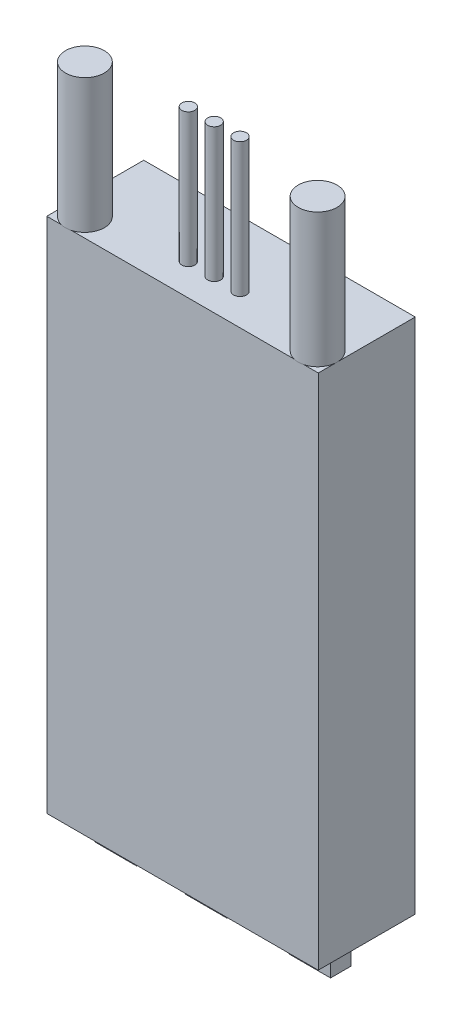
ISO-10303-21;
HEADER;
FILE_DESCRIPTION(('STEP AP214'),'2;1');
FILE_NAME('part.step','',(''),(''),'','','');
FILE_SCHEMA(('AUTOMOTIVE_DESIGN { 1 0 10303 214 1 1 1 1 }'));
ENDSEC;
DATA;
#1=APPLICATION_CONTEXT('core data for automotive mechanical design processes');
#2=APPLICATION_PROTOCOL_DEFINITION('international standard','automotive_design',2000,#1);
#3=PRODUCT_CONTEXT('',#1,'mechanical');
#4=PRODUCT('Part','Part','',(#3));
#5=PRODUCT_RELATED_PRODUCT_CATEGORY('part','',(#4));
#6=PRODUCT_DEFINITION_FORMATION('','',#4);
#7=PRODUCT_DEFINITION_CONTEXT('part definition',#1,'design');
#8=PRODUCT_DEFINITION('design','',#6,#7);
#9=PRODUCT_DEFINITION_SHAPE('','',#8);
#10=(LENGTH_UNIT() NAMED_UNIT(*) SI_UNIT(.MILLI.,.METRE.));
#11=(NAMED_UNIT(*) PLANE_ANGLE_UNIT() SI_UNIT($,.RADIAN.));
#12=(NAMED_UNIT(*) SI_UNIT($,.STERADIAN.) SOLID_ANGLE_UNIT());
#13=UNCERTAINTY_MEASURE_WITH_UNIT(LENGTH_MEASURE(1.E-05),#10,'distance_accuracy_value','');
#14=(GEOMETRIC_REPRESENTATION_CONTEXT(3) GLOBAL_UNCERTAINTY_ASSIGNED_CONTEXT((#13)) GLOBAL_UNIT_ASSIGNED_CONTEXT((#10,
#11,#12)) REPRESENTATION_CONTEXT('',''));
#15=CARTESIAN_POINT('',(0.,0.,0.));
#16=DIRECTION('',(0.,0.,1.));
#17=DIRECTION('',(1.,0.,0.));
#18=AXIS2_PLACEMENT_3D('',#15,#16,#17);
#19=CARTESIAN_POINT('',(-10.5,20.,3.75));
#20=DIRECTION('',(0.,-1.,0.));
#21=DIRECTION('',(1.,0.,0.));
#22=AXIS2_PLACEMENT_3D('',#19,#20,#21);
#23=PLANE('',#22);
#24=CARTESIAN_POINT('',(9.,20.,2.3));
#25=DIRECTION('',(0.,1.,0.));
#26=DIRECTION('',(-1.,0.,0.));
#27=AXIS2_PLACEMENT_3D('',#24,#25,#26);
#28=CIRCLE('',#27,1.5);
#29=CARTESIAN_POINT('',(9.38405728739343,20.,3.75));
#30=VERTEX_POINT('',#29);
#31=CARTESIAN_POINT('',(10.5,20.,2.3));
#32=VERTEX_POINT('',#31);
#33=EDGE_CURVE('E11',#30,#32,#28,.T.);
#34=ORIENTED_EDGE('',*,*,#33,.F.);
#35=DIRECTION('',(-1.,0.,0.));
#36=VECTOR('',#35,1.);
#37=CARTESIAN_POINT('',(-10.5,20.,3.75));
#38=LINE('',#37,#36);
#39=CARTESIAN_POINT('',(10.5,20.,3.75));
#40=VERTEX_POINT('',#39);
#41=EDGE_CURVE('E302',#40,#30,#38,.T.);
#42=ORIENTED_EDGE('',*,*,#41,.F.);
#43=DIRECTION('',(0.,0.,-1.));
#44=VECTOR('',#43,1.);
#45=CARTESIAN_POINT('',(10.5,20.,3.75));
#46=LINE('',#45,#44);
#47=EDGE_CURVE('E323',#40,#32,#46,.T.);
#48=ORIENTED_EDGE('',*,*,#47,.T.);
#49=EDGE_LOOP('',(#34,#42,#48));
#50=FACE_BOUND('',#49,.T.);
#51=ADVANCED_FACE('F39',(#50),#23,.F.);
#52=CARTESIAN_POINT('',(-9.,20.,2.3));
#53=DIRECTION('',(0.,1.,0.));
#54=DIRECTION('',(-1.,0.,0.));
#55=AXIS2_PLACEMENT_3D('',#52,#53,#54);
#56=CIRCLE('',#55,1.5);
#57=CARTESIAN_POINT('',(-10.5,20.,2.3));
#58=VERTEX_POINT('',#57);
#59=CARTESIAN_POINT('',(-9.38405728739343,20.,3.75));
#60=VERTEX_POINT('',#59);
#61=EDGE_CURVE('E187',#58,#60,#56,.T.);
#62=ORIENTED_EDGE('',*,*,#61,.F.);
#63=DIRECTION('',(0.,0.,-1.));
#64=VECTOR('',#63,1.);
#65=CARTESIAN_POINT('',(-10.5,20.,3.75));
#66=LINE('',#65,#64);
#67=CARTESIAN_POINT('',(-10.5,20.,3.75));
#68=VERTEX_POINT('',#67);
#69=EDGE_CURVE('E43',#68,#58,#66,.T.);
#70=ORIENTED_EDGE('',*,*,#69,.F.);
#71=EDGE_CURVE('E65',#60,#68,#38,.T.);
#72=ORIENTED_EDGE('',*,*,#71,.F.);
#73=EDGE_LOOP('',(#62,#70,#72));
#74=FACE_BOUND('',#73,.T.);
#75=ADVANCED_FACE('F190',(#74),#23,.F.);
#76=CARTESIAN_POINT('',(8.61594271260657,20.,3.75));
#77=VERTEX_POINT('',#76);
#78=EDGE_CURVE('E48',#32,#77,#28,.T.);
#79=ORIENTED_EDGE('',*,*,#78,.F.);
#80=CARTESIAN_POINT('',(10.5,20.,-3.75));
#81=VERTEX_POINT('',#80);
#82=EDGE_CURVE('E314',#32,#81,#46,.T.);
#83=ORIENTED_EDGE('',*,*,#82,.T.);
#84=DIRECTION('',(-1.,0.,0.));
#85=VECTOR('',#84,1.);
#86=CARTESIAN_POINT('',(-10.5,20.,-3.75));
#87=LINE('',#86,#85);
#88=CARTESIAN_POINT('',(-10.5,20.,-3.75));
#89=VERTEX_POINT('',#88);
#90=EDGE_CURVE('E183',#81,#89,#87,.T.);
#91=ORIENTED_EDGE('',*,*,#90,.T.);
#92=EDGE_CURVE('E171',#58,#89,#66,.T.);
#93=ORIENTED_EDGE('',*,*,#92,.F.);
#94=CARTESIAN_POINT('',(-8.61594271260657,20.,3.75));
#95=VERTEX_POINT('',#94);
#96=EDGE_CURVE('E179',#95,#58,#56,.T.);
#97=ORIENTED_EDGE('',*,*,#96,.F.);
#98=EDGE_CURVE('E350',#77,#95,#38,.T.);
#99=ORIENTED_EDGE('',*,*,#98,.F.);
#100=EDGE_LOOP('',(#79,#83,#91,#93,#97,#99));
#101=FACE_BOUND('',#100,.T.);
#102=CARTESIAN_POINT('',(-2.00000000000001,20.,1.3));
#103=DIRECTION('',(0.,1.,0.));
#104=DIRECTION('',(-1.,0.,0.));
#105=AXIS2_PLACEMENT_3D('',#102,#103,#104);
#106=CIRCLE('',#105,0.5);
#107=CARTESIAN_POINT('',(-2.50000000000001,20.,1.3));
#108=VERTEX_POINT('',#107);
#109=EDGE_CURVE('E352',#108,#108,#106,.T.);
#110=ORIENTED_EDGE('',*,*,#109,.F.);
#111=EDGE_LOOP('',(#110));
#112=FACE_BOUND('',#111,.T.);
#113=CARTESIAN_POINT('',(1.99999999999999,20.,1.3));
#114=DIRECTION('',(0.,1.,0.));
#115=DIRECTION('',(-1.,0.,0.));
#116=AXIS2_PLACEMENT_3D('',#113,#114,#115);
#117=CIRCLE('',#116,0.5);
#118=CARTESIAN_POINT('',(1.49999999999999,20.,1.3));
#119=VERTEX_POINT('',#118);
#120=EDGE_CURVE('E196',#119,#119,#117,.T.);
#121=ORIENTED_EDGE('',*,*,#120,.F.);
#122=EDGE_LOOP('',(#121));
#123=FACE_BOUND('',#122,.T.);
#124=CARTESIAN_POINT('',(0.,20.,1.3));
#125=DIRECTION('',(0.,1.,0.));
#126=DIRECTION('',(-1.,0.,0.));
#127=AXIS2_PLACEMENT_3D('',#124,#125,#126);
#128=CIRCLE('',#127,0.5);
#129=CARTESIAN_POINT('',(-0.500000000000007,20.,1.3));
#130=VERTEX_POINT('',#129);
#131=EDGE_CURVE('E198',#130,#130,#128,.T.);
#132=ORIENTED_EDGE('',*,*,#131,.F.);
#133=EDGE_LOOP('',(#132));
#134=FACE_BOUND('',#133,.T.);
#135=ADVANCED_FACE('F41',(#101,#112,#123,#134),#23,.F.);
#136=CARTESIAN_POINT('',(-10.5,-20.,3.75));
#137=DIRECTION('',(1.,0.,0.));
#138=DIRECTION('',(0.,0.,-1.));
#139=AXIS2_PLACEMENT_3D('',#136,#137,#138);
#140=PLANE('',#139);
#141=DIRECTION('',(0.,-1.,0.));
#142=VECTOR('',#141,1.);
#143=CARTESIAN_POINT('',(-10.5,-20.,-3.75));
#144=LINE('',#143,#142);
#145=CARTESIAN_POINT('',(-10.5,-20.,-3.75));
#146=VERTEX_POINT('',#145);
#147=EDGE_CURVE('E316',#89,#146,#144,.T.);
#148=ORIENTED_EDGE('',*,*,#147,.T.);
#149=DIRECTION('',(0.,0.,-1.));
#150=VECTOR('',#149,1.);
#151=CARTESIAN_POINT('',(-10.5,-20.,3.75));
#152=LINE('',#151,#150);
#153=CARTESIAN_POINT('',(-10.5,-20.,3.75));
#154=VERTEX_POINT('',#153);
#155=EDGE_CURVE('E188',#154,#146,#152,.T.);
#156=ORIENTED_EDGE('',*,*,#155,.F.);
#157=DIRECTION('',(0.,-1.,0.));
#158=VECTOR('',#157,1.);
#159=CARTESIAN_POINT('',(-10.5,-20.,3.75));
#160=LINE('',#159,#158);
#161=EDGE_CURVE('E176',#68,#154,#160,.T.);
#162=ORIENTED_EDGE('',*,*,#161,.F.);
#163=ORIENTED_EDGE('',*,*,#69,.T.);
#164=ORIENTED_EDGE('',*,*,#92,.T.);
#165=EDGE_LOOP('',(#148,#156,#162,#163,#164));
#166=FACE_BOUND('',#165,.T.);
#167=ADVANCED_FACE('F175',(#166),#140,.F.);
#168=CARTESIAN_POINT('',(-10.5,-20.,3.75));
#169=DIRECTION('',(0.,1.,0.));
#170=DIRECTION('',(-1.,0.,0.));
#171=AXIS2_PLACEMENT_3D('',#168,#169,#170);
#172=PLANE('',#171);
#173=DIRECTION('',(0.,0.,-1.));
#174=VECTOR('',#173,1.);
#175=CARTESIAN_POINT('',(-6.5,-20.,0.8));
#176=LINE('',#175,#174);
#177=CARTESIAN_POINT('',(-6.5,-20.,0.8));
#178=VERTEX_POINT('',#177);
#179=CARTESIAN_POINT('',(-6.5,-20.,-0.8));
#180=VERTEX_POINT('',#179);
#181=EDGE_CURVE('E222',#178,#180,#176,.T.);
#182=ORIENTED_EDGE('',*,*,#181,.T.);
#183=DIRECTION('',(-1.,0.,0.));
#184=VECTOR('',#183,1.);
#185=CARTESIAN_POINT('',(-9.7,-20.,-0.8));
#186=LINE('',#185,#184);
#187=CARTESIAN_POINT('',(-9.7,-20.,-0.8));
#188=VERTEX_POINT('',#187);
#189=EDGE_CURVE('E225',#180,#188,#186,.T.);
#190=ORIENTED_EDGE('',*,*,#189,.T.);
#191=DIRECTION('',(0.,0.,-1.));
#192=VECTOR('',#191,1.);
#193=CARTESIAN_POINT('',(-9.7,-20.,0.8));
#194=LINE('',#193,#192);
#195=CARTESIAN_POINT('',(-9.7,-20.,0.8));
#196=VERTEX_POINT('',#195);
#197=EDGE_CURVE('E238',#196,#188,#194,.T.);
#198=ORIENTED_EDGE('',*,*,#197,.F.);
#199=DIRECTION('',(-1.,0.,0.));
#200=VECTOR('',#199,1.);
#201=CARTESIAN_POINT('',(-9.7,-20.,0.8));
#202=LINE('',#201,#200);
#203=EDGE_CURVE('E211',#178,#196,#202,.T.);
#204=ORIENTED_EDGE('',*,*,#203,.F.);
#205=EDGE_LOOP('',(#182,#190,#198,#204));
#206=FACE_BOUND('',#205,.T.);
#207=DIRECTION('',(0.,0.,-1.));
#208=VECTOR('',#207,1.);
#209=CARTESIAN_POINT('',(0.500000000000002,-20.,0.8));
#210=LINE('',#209,#208);
#211=CARTESIAN_POINT('',(0.500000000000002,-20.,0.8));
#212=VERTEX_POINT('',#211);
#213=CARTESIAN_POINT('',(0.500000000000002,-20.,-0.8));
#214=VERTEX_POINT('',#213);
#215=EDGE_CURVE('E251',#212,#214,#210,.T.);
#216=ORIENTED_EDGE('',*,*,#215,.T.);
#217=DIRECTION('',(-1.,0.,0.));
#218=VECTOR('',#217,1.);
#219=CARTESIAN_POINT('',(-2.7,-20.,-0.8));
#220=LINE('',#219,#218);
#221=CARTESIAN_POINT('',(-2.7,-20.,-0.8));
#222=VERTEX_POINT('',#221);
#223=EDGE_CURVE('E228',#214,#222,#220,.T.);
#224=ORIENTED_EDGE('',*,*,#223,.T.);
#225=DIRECTION('',(0.,0.,-1.));
#226=VECTOR('',#225,1.);
#227=CARTESIAN_POINT('',(-2.7,-20.,0.8));
#228=LINE('',#227,#226);
#229=CARTESIAN_POINT('',(-2.7,-20.,0.8));
#230=VERTEX_POINT('',#229);
#231=EDGE_CURVE('E242',#230,#222,#228,.T.);
#232=ORIENTED_EDGE('',*,*,#231,.F.);
#233=DIRECTION('',(-1.,0.,0.));
#234=VECTOR('',#233,1.);
#235=CARTESIAN_POINT('',(-2.7,-20.,0.8));
#236=LINE('',#235,#234);
#237=EDGE_CURVE('E261',#212,#230,#236,.T.);
#238=ORIENTED_EDGE('',*,*,#237,.F.);
#239=EDGE_LOOP('',(#216,#224,#232,#238));
#240=FACE_BOUND('',#239,.T.);
#241=DIRECTION('',(0.,0.,-1.));
#242=VECTOR('',#241,1.);
#243=CARTESIAN_POINT('',(8.5,-20.,0.8));
#244=LINE('',#243,#242);
#245=CARTESIAN_POINT('',(8.5,-20.,0.8));
#246=VERTEX_POINT('',#245);
#247=CARTESIAN_POINT('',(8.5,-20.,-0.8));
#248=VERTEX_POINT('',#247);
#249=EDGE_CURVE('E285',#246,#248,#244,.T.);
#250=ORIENTED_EDGE('',*,*,#249,.T.);
#251=DIRECTION('',(-1.,0.,0.));
#252=VECTOR('',#251,1.);
#253=CARTESIAN_POINT('',(5.3,-20.,-0.8));
#254=LINE('',#253,#252);
#255=CARTESIAN_POINT('',(5.3,-20.,-0.8));
#256=VERTEX_POINT('',#255);
#257=EDGE_CURVE('E250',#248,#256,#254,.T.);
#258=ORIENTED_EDGE('',*,*,#257,.T.);
#259=DIRECTION('',(0.,0.,-1.));
#260=VECTOR('',#259,1.);
#261=CARTESIAN_POINT('',(5.3,-20.,0.8));
#262=LINE('',#261,#260);
#263=CARTESIAN_POINT('',(5.3,-20.,0.8));
#264=VERTEX_POINT('',#263);
#265=EDGE_CURVE('E273',#264,#256,#262,.T.);
#266=ORIENTED_EDGE('',*,*,#265,.F.);
#267=DIRECTION('',(-1.,0.,0.));
#268=VECTOR('',#267,1.);
#269=CARTESIAN_POINT('',(5.3,-20.,0.8));
#270=LINE('',#269,#268);
#271=EDGE_CURVE('E295',#246,#264,#270,.T.);
#272=ORIENTED_EDGE('',*,*,#271,.F.);
#273=EDGE_LOOP('',(#250,#258,#266,#272));
#274=FACE_BOUND('',#273,.T.);
#275=DIRECTION('',(1.,0.,0.));
#276=VECTOR('',#275,1.);
#277=CARTESIAN_POINT('',(-10.5,-20.,-3.75));
#278=LINE('',#277,#276);
#279=CARTESIAN_POINT('',(10.5,-20.,-3.75));
#280=VERTEX_POINT('',#279);
#281=EDGE_CURVE('E318',#146,#280,#278,.T.);
#282=ORIENTED_EDGE('',*,*,#281,.T.);
#283=DIRECTION('',(0.,0.,-1.));
#284=VECTOR('',#283,1.);
#285=CARTESIAN_POINT('',(10.5,-20.,3.75));
#286=LINE('',#285,#284);
#287=CARTESIAN_POINT('',(10.5,-20.,3.75));
#288=VERTEX_POINT('',#287);
#289=EDGE_CURVE('E326',#288,#280,#286,.T.);
#290=ORIENTED_EDGE('',*,*,#289,.F.);
#291=DIRECTION('',(1.,0.,0.));
#292=VECTOR('',#291,1.);
#293=CARTESIAN_POINT('',(-10.5,-20.,3.75));
#294=LINE('',#293,#292);
#295=EDGE_CURVE('E309',#154,#288,#294,.T.);
#296=ORIENTED_EDGE('',*,*,#295,.F.);
#297=ORIENTED_EDGE('',*,*,#155,.T.);
#298=EDGE_LOOP('',(#282,#290,#296,#297));
#299=FACE_BOUND('',#298,.T.);
#300=ADVANCED_FACE('F335',(#206,#240,#274,#299),#172,.F.);
#301=CARTESIAN_POINT('',(10.5,-20.,3.75));
#302=DIRECTION('',(-1.,0.,0.));
#303=DIRECTION('',(0.,0.,1.));
#304=AXIS2_PLACEMENT_3D('',#301,#302,#303);
#305=PLANE('',#304);
#306=DIRECTION('',(0.,1.,0.));
#307=VECTOR('',#306,1.);
#308=CARTESIAN_POINT('',(10.5,-20.,-3.75));
#309=LINE('',#308,#307);
#310=EDGE_CURVE('E319',#280,#81,#309,.T.);
#311=ORIENTED_EDGE('',*,*,#310,.T.);
#312=ORIENTED_EDGE('',*,*,#82,.F.);
#313=ORIENTED_EDGE('',*,*,#47,.F.);
#314=DIRECTION('',(0.,1.,0.));
#315=VECTOR('',#314,1.);
#316=CARTESIAN_POINT('',(10.5,-20.,3.75));
#317=LINE('',#316,#315);
#318=EDGE_CURVE('E315',#288,#40,#317,.T.);
#319=ORIENTED_EDGE('',*,*,#318,.F.);
#320=ORIENTED_EDGE('',*,*,#289,.T.);
#321=EDGE_LOOP('',(#311,#312,#313,#319,#320));
#322=FACE_BOUND('',#321,.T.);
#323=ADVANCED_FACE('F337',(#322),#305,.F.);
#324=CARTESIAN_POINT('',(0.,0.,3.75));
#325=DIRECTION('',(0.,0.,1.));
#326=DIRECTION('',(1.,0.,0.));
#327=AXIS2_PLACEMENT_3D('',#324,#325,#326);
#328=PLANE('',#327);
#329=ORIENTED_EDGE('',*,*,#41,.T.);
#330=EDGE_CURVE('E306',#30,#77,#38,.T.);
#331=ORIENTED_EDGE('',*,*,#330,.T.);
#332=ORIENTED_EDGE('',*,*,#98,.T.);
#333=EDGE_CURVE('E347',#95,#60,#38,.T.);
#334=ORIENTED_EDGE('',*,*,#333,.T.);
#335=ORIENTED_EDGE('',*,*,#71,.T.);
#336=ORIENTED_EDGE('',*,*,#161,.T.);
#337=ORIENTED_EDGE('',*,*,#295,.T.);
#338=ORIENTED_EDGE('',*,*,#318,.T.);
#339=EDGE_LOOP('',(#329,#331,#332,#334,#335,#336,#337,#338));
#340=FACE_BOUND('',#339,.T.);
#341=ADVANCED_FACE('F341',(#340),#328,.T.);
#342=CARTESIAN_POINT('',(0.,0.,-3.75));
#343=DIRECTION('',(0.,0.,1.));
#344=DIRECTION('',(1.,0.,0.));
#345=AXIS2_PLACEMENT_3D('',#342,#343,#344);
#346=PLANE('',#345);
#347=ORIENTED_EDGE('',*,*,#90,.F.);
#348=ORIENTED_EDGE('',*,*,#310,.F.);
#349=ORIENTED_EDGE('',*,*,#281,.F.);
#350=ORIENTED_EDGE('',*,*,#147,.F.);
#351=EDGE_LOOP('',(#347,#348,#349,#350));
#352=FACE_BOUND('',#351,.T.);
#353=ADVANCED_FACE('F338',(#352),#346,.F.);
#354=CARTESIAN_POINT('',(5.3,-20.,0.8));
#355=DIRECTION('',(1.,0.,0.));
#356=DIRECTION('',(0.,1.,0.));
#357=AXIS2_PLACEMENT_3D('',#354,#355,#356);
#358=PLANE('',#357);
#359=DIRECTION('',(0.,-1.,0.));
#360=VECTOR('',#359,1.);
#361=CARTESIAN_POINT('',(5.3,-20.,-0.8));
#362=LINE('',#361,#360);
#363=CARTESIAN_POINT('',(5.3,-23.,-0.8));
#364=VERTEX_POINT('',#363);
#365=EDGE_CURVE('E294',#256,#364,#362,.T.);
#366=ORIENTED_EDGE('',*,*,#365,.T.);
#367=DIRECTION('',(0.,0.,-1.));
#368=VECTOR('',#367,1.);
#369=CARTESIAN_POINT('',(5.3,-23.,0.8));
#370=LINE('',#369,#368);
#371=CARTESIAN_POINT('',(5.3,-23.,0.8));
#372=VERTEX_POINT('',#371);
#373=EDGE_CURVE('E280',#372,#364,#370,.T.);
#374=ORIENTED_EDGE('',*,*,#373,.F.);
#375=DIRECTION('',(0.,-1.,0.));
#376=VECTOR('',#375,1.);
#377=CARTESIAN_POINT('',(5.3,-20.,0.8));
#378=LINE('',#377,#376);
#379=EDGE_CURVE('E303',#264,#372,#378,.T.);
#380=ORIENTED_EDGE('',*,*,#379,.F.);
#381=ORIENTED_EDGE('',*,*,#265,.T.);
#382=EDGE_LOOP('',(#366,#374,#380,#381));
#383=FACE_BOUND('',#382,.T.);
#384=ADVANCED_FACE('F675',(#383),#358,.F.);
#385=CARTESIAN_POINT('',(5.3,-23.,0.8));
#386=DIRECTION('',(0.,1.,0.));
#387=DIRECTION('',(-1.,0.,0.));
#388=AXIS2_PLACEMENT_3D('',#385,#386,#387);
#389=PLANE('',#388);
#390=DIRECTION('',(1.,0.,0.));
#391=VECTOR('',#390,1.);
#392=CARTESIAN_POINT('',(5.3,-23.,-0.8));
#393=LINE('',#392,#391);
#394=CARTESIAN_POINT('',(8.5,-23.,-0.8));
#395=VERTEX_POINT('',#394);
#396=EDGE_CURVE('E292',#364,#395,#393,.T.);
#397=ORIENTED_EDGE('',*,*,#396,.T.);
#398=DIRECTION('',(0.,0.,-1.));
#399=VECTOR('',#398,1.);
#400=CARTESIAN_POINT('',(8.5,-23.,0.8));
#401=LINE('',#400,#399);
#402=CARTESIAN_POINT('',(8.5,-23.,0.8));
#403=VERTEX_POINT('',#402);
#404=EDGE_CURVE('E283',#403,#395,#401,.T.);
#405=ORIENTED_EDGE('',*,*,#404,.F.);
#406=DIRECTION('',(1.,0.,0.));
#407=VECTOR('',#406,1.);
#408=CARTESIAN_POINT('',(5.3,-23.,0.8));
#409=LINE('',#408,#407);
#410=EDGE_CURVE('E300',#372,#403,#409,.T.);
#411=ORIENTED_EDGE('',*,*,#410,.F.);
#412=ORIENTED_EDGE('',*,*,#373,.T.);
#413=EDGE_LOOP('',(#397,#405,#411,#412));
#414=FACE_BOUND('',#413,.T.);
#415=ADVANCED_FACE('F665',(#414),#389,.F.);
#416=CARTESIAN_POINT('',(8.5,-20.,0.8));
#417=DIRECTION('',(-1.,0.,0.));
#418=DIRECTION('',(0.,0.,1.));
#419=AXIS2_PLACEMENT_3D('',#416,#417,#418);
#420=PLANE('',#419);
#421=DIRECTION('',(0.,1.,0.));
#422=VECTOR('',#421,1.);
#423=CARTESIAN_POINT('',(8.5,-20.,-0.8));
#424=LINE('',#423,#422);
#425=EDGE_CURVE('E286',#395,#248,#424,.T.);
#426=ORIENTED_EDGE('',*,*,#425,.T.);
#427=ORIENTED_EDGE('',*,*,#249,.F.);
#428=DIRECTION('',(0.,1.,0.));
#429=VECTOR('',#428,1.);
#430=CARTESIAN_POINT('',(8.5,-20.,0.8));
#431=LINE('',#430,#429);
#432=EDGE_CURVE('E290',#403,#246,#431,.T.);
#433=ORIENTED_EDGE('',*,*,#432,.F.);
#434=ORIENTED_EDGE('',*,*,#404,.T.);
#435=EDGE_LOOP('',(#426,#427,#433,#434));
#436=FACE_BOUND('',#435,.T.);
#437=ADVANCED_FACE('F655',(#436),#420,.F.);
#438=CARTESIAN_POINT('',(0.,0.,0.8));
#439=DIRECTION('',(0.,0.,-1.));
#440=DIRECTION('',(-1.,0.,0.));
#441=AXIS2_PLACEMENT_3D('',#438,#439,#440);
#442=PLANE('',#441);
#443=ORIENTED_EDGE('',*,*,#271,.T.);
#444=ORIENTED_EDGE('',*,*,#379,.T.);
#445=ORIENTED_EDGE('',*,*,#410,.T.);
#446=ORIENTED_EDGE('',*,*,#432,.T.);
#447=EDGE_LOOP('',(#443,#444,#445,#446));
#448=FACE_BOUND('',#447,.T.);
#449=ADVANCED_FACE('F645',(#448),#442,.F.);
#450=CARTESIAN_POINT('',(0.,0.,-0.8));
#451=DIRECTION('',(0.,0.,-1.));
#452=DIRECTION('',(-1.,0.,0.));
#453=AXIS2_PLACEMENT_3D('',#450,#451,#452);
#454=PLANE('',#453);
#455=ORIENTED_EDGE('',*,*,#257,.F.);
#456=ORIENTED_EDGE('',*,*,#425,.F.);
#457=ORIENTED_EDGE('',*,*,#396,.F.);
#458=ORIENTED_EDGE('',*,*,#365,.F.);
#459=EDGE_LOOP('',(#455,#456,#457,#458));
#460=FACE_BOUND('',#459,.T.);
#461=ADVANCED_FACE('F635',(#460),#454,.T.);
#462=CARTESIAN_POINT('',(-2.7,-20.,0.8));
#463=DIRECTION('',(1.,0.,0.));
#464=DIRECTION('',(0.,0.,-1.));
#465=AXIS2_PLACEMENT_3D('',#462,#463,#464);
#466=PLANE('',#465);
#467=DIRECTION('',(0.,-1.,0.));
#468=VECTOR('',#467,1.);
#469=CARTESIAN_POINT('',(-2.7,-20.,-0.8));
#470=LINE('',#469,#468);
#471=CARTESIAN_POINT('',(-2.7,-23.,-0.8));
#472=VERTEX_POINT('',#471);
#473=EDGE_CURVE('E263',#222,#472,#470,.T.);
#474=ORIENTED_EDGE('',*,*,#473,.T.);
#475=DIRECTION('',(0.,0.,-1.));
#476=VECTOR('',#475,1.);
#477=CARTESIAN_POINT('',(-2.7,-23.,0.8));
#478=LINE('',#477,#476);
#479=CARTESIAN_POINT('',(-2.7,-23.,0.8));
#480=VERTEX_POINT('',#479);
#481=EDGE_CURVE('E248',#480,#472,#478,.T.);
#482=ORIENTED_EDGE('',*,*,#481,.F.);
#483=DIRECTION('',(0.,-1.,0.));
#484=VECTOR('',#483,1.);
#485=CARTESIAN_POINT('',(-2.7,-20.,0.8));
#486=LINE('',#485,#484);
#487=EDGE_CURVE('E269',#230,#480,#486,.T.);
#488=ORIENTED_EDGE('',*,*,#487,.F.);
#489=ORIENTED_EDGE('',*,*,#231,.T.);
#490=EDGE_LOOP('',(#474,#482,#488,#489));
#491=FACE_BOUND('',#490,.T.);
#492=ADVANCED_FACE('F625',(#491),#466,.F.);
#493=CARTESIAN_POINT('',(-2.7,-23.,0.8));
#494=DIRECTION('',(0.,1.,0.));
#495=DIRECTION('',(0.,0.,1.));
#496=AXIS2_PLACEMENT_3D('',#493,#494,#495);
#497=PLANE('',#496);
#498=DIRECTION('',(1.,0.,0.));
#499=VECTOR('',#498,1.);
#500=CARTESIAN_POINT('',(-2.7,-23.,-0.8));
#501=LINE('',#500,#499);
#502=CARTESIAN_POINT('',(0.500000000000002,-23.,-0.8));
#503=VERTEX_POINT('',#502);
#504=EDGE_CURVE('E257',#472,#503,#501,.T.);
#505=ORIENTED_EDGE('',*,*,#504,.T.);
#506=DIRECTION('',(0.,0.,-1.));
#507=VECTOR('',#506,1.);
#508=CARTESIAN_POINT('',(0.500000000000002,-23.,0.8));
#509=LINE('',#508,#507);
#510=CARTESIAN_POINT('',(0.500000000000002,-23.,0.8));
#511=VERTEX_POINT('',#510);
#512=EDGE_CURVE('E247',#511,#503,#509,.T.);
#513=ORIENTED_EDGE('',*,*,#512,.F.);
#514=DIRECTION('',(1.,0.,0.));
#515=VECTOR('',#514,1.);
#516=CARTESIAN_POINT('',(-2.7,-23.,0.8));
#517=LINE('',#516,#515);
#518=EDGE_CURVE('E268',#480,#511,#517,.T.);
#519=ORIENTED_EDGE('',*,*,#518,.F.);
#520=ORIENTED_EDGE('',*,*,#481,.T.);
#521=EDGE_LOOP('',(#505,#513,#519,#520));
#522=FACE_BOUND('',#521,.T.);
#523=ADVANCED_FACE('F614',(#522),#497,.F.);
#524=CARTESIAN_POINT('',(0.500000000000002,-20.,0.8));
#525=DIRECTION('',(-1.,0.,0.));
#526=DIRECTION('',(0.,-1.,0.));
#527=AXIS2_PLACEMENT_3D('',#524,#525,#526);
#528=PLANE('',#527);
#529=DIRECTION('',(0.,1.,0.));
#530=VECTOR('',#529,1.);
#531=CARTESIAN_POINT('',(0.500000000000002,-20.,-0.8));
#532=LINE('',#531,#530);
#533=EDGE_CURVE('E260',#503,#214,#532,.T.);
#534=ORIENTED_EDGE('',*,*,#533,.T.);
#535=ORIENTED_EDGE('',*,*,#215,.F.);
#536=DIRECTION('',(0.,1.,0.));
#537=VECTOR('',#536,1.);
#538=CARTESIAN_POINT('',(0.500000000000002,-20.,0.8));
#539=LINE('',#538,#537);
#540=EDGE_CURVE('E258',#511,#212,#539,.T.);
#541=ORIENTED_EDGE('',*,*,#540,.F.);
#542=ORIENTED_EDGE('',*,*,#512,.T.);
#543=EDGE_LOOP('',(#534,#535,#541,#542));
#544=FACE_BOUND('',#543,.T.);
#545=ADVANCED_FACE('F605',(#544),#528,.F.);
#546=CARTESIAN_POINT('',(0.,0.,0.8));
#547=DIRECTION('',(0.,0.,-1.));
#548=DIRECTION('',(-1.,0.,0.));
#549=AXIS2_PLACEMENT_3D('',#546,#547,#548);
#550=PLANE('',#549);
#551=ORIENTED_EDGE('',*,*,#237,.T.);
#552=ORIENTED_EDGE('',*,*,#487,.T.);
#553=ORIENTED_EDGE('',*,*,#518,.T.);
#554=ORIENTED_EDGE('',*,*,#540,.T.);
#555=EDGE_LOOP('',(#551,#552,#553,#554));
#556=FACE_BOUND('',#555,.T.);
#557=ADVANCED_FACE('F595',(#556),#550,.F.);
#558=CARTESIAN_POINT('',(0.,0.,-0.8));
#559=DIRECTION('',(0.,0.,-1.));
#560=DIRECTION('',(-1.,0.,0.));
#561=AXIS2_PLACEMENT_3D('',#558,#559,#560);
#562=PLANE('',#561);
#563=ORIENTED_EDGE('',*,*,#223,.F.);
#564=ORIENTED_EDGE('',*,*,#533,.F.);
#565=ORIENTED_EDGE('',*,*,#504,.F.);
#566=ORIENTED_EDGE('',*,*,#473,.F.);
#567=EDGE_LOOP('',(#563,#564,#565,#566));
#568=FACE_BOUND('',#567,.T.);
#569=ADVANCED_FACE('F582',(#568),#562,.T.);
#570=CARTESIAN_POINT('',(-9.7,-20.,0.8));
#571=DIRECTION('',(1.,0.,0.));
#572=DIRECTION('',(0.,0.,-1.));
#573=AXIS2_PLACEMENT_3D('',#570,#571,#572);
#574=PLANE('',#573);
#575=DIRECTION('',(0.,-1.,0.));
#576=VECTOR('',#575,1.);
#577=CARTESIAN_POINT('',(-9.7,-20.,-0.8));
#578=LINE('',#577,#576);
#579=CARTESIAN_POINT('',(-9.7,-23.,-0.8));
#580=VERTEX_POINT('',#579);
#581=EDGE_CURVE('E223',#188,#580,#578,.T.);
#582=ORIENTED_EDGE('',*,*,#581,.T.);
#583=DIRECTION('',(0.,0.,-1.));
#584=VECTOR('',#583,1.);
#585=CARTESIAN_POINT('',(-9.7,-23.,0.8));
#586=LINE('',#585,#584);
#587=CARTESIAN_POINT('',(-9.7,-23.,0.8));
#588=VERTEX_POINT('',#587);
#589=EDGE_CURVE('E240',#588,#580,#586,.T.);
#590=ORIENTED_EDGE('',*,*,#589,.F.);
#591=DIRECTION('',(0.,-1.,0.));
#592=VECTOR('',#591,1.);
#593=CARTESIAN_POINT('',(-9.7,-20.,0.8));
#594=LINE('',#593,#592);
#595=EDGE_CURVE('E212',#196,#588,#594,.T.);
#596=ORIENTED_EDGE('',*,*,#595,.F.);
#597=ORIENTED_EDGE('',*,*,#197,.T.);
#598=EDGE_LOOP('',(#582,#590,#596,#597));
#599=FACE_BOUND('',#598,.T.);
#600=ADVANCED_FACE('F574',(#599),#574,.F.);
#601=CARTESIAN_POINT('',(-9.7,-23.,0.8));
#602=DIRECTION('',(0.,1.,0.));
#603=DIRECTION('',(0.,0.,1.));
#604=AXIS2_PLACEMENT_3D('',#601,#602,#603);
#605=PLANE('',#604);
#606=DIRECTION('',(1.,0.,0.));
#607=VECTOR('',#606,1.);
#608=CARTESIAN_POINT('',(-9.7,-23.,-0.8));
#609=LINE('',#608,#607);
#610=CARTESIAN_POINT('',(-6.5,-23.,-0.8));
#611=VERTEX_POINT('',#610);
#612=EDGE_CURVE('E227',#580,#611,#609,.T.);
#613=ORIENTED_EDGE('',*,*,#612,.T.);
#614=DIRECTION('',(0.,0.,-1.));
#615=VECTOR('',#614,1.);
#616=CARTESIAN_POINT('',(-6.5,-23.,0.8));
#617=LINE('',#616,#615);
#618=CARTESIAN_POINT('',(-6.5,-23.,0.8));
#619=VERTEX_POINT('',#618);
#620=EDGE_CURVE('E234',#619,#611,#617,.T.);
#621=ORIENTED_EDGE('',*,*,#620,.F.);
#622=DIRECTION('',(1.,0.,0.));
#623=VECTOR('',#622,1.);
#624=CARTESIAN_POINT('',(-9.7,-23.,0.8));
#625=LINE('',#624,#623);
#626=EDGE_CURVE('E220',#588,#619,#625,.T.);
#627=ORIENTED_EDGE('',*,*,#626,.F.);
#628=ORIENTED_EDGE('',*,*,#589,.T.);
#629=EDGE_LOOP('',(#613,#621,#627,#628));
#630=FACE_BOUND('',#629,.T.);
#631=ADVANCED_FACE('F565',(#630),#605,.F.);
#632=CARTESIAN_POINT('',(-6.5,-20.,0.8));
#633=DIRECTION('',(-1.,0.,0.));
#634=DIRECTION('',(0.,0.,1.));
#635=AXIS2_PLACEMENT_3D('',#632,#633,#634);
#636=PLANE('',#635);
#637=DIRECTION('',(0.,1.,0.));
#638=VECTOR('',#637,1.);
#639=CARTESIAN_POINT('',(-6.5,-20.,-0.8));
#640=LINE('',#639,#638);
#641=EDGE_CURVE('E214',#611,#180,#640,.T.);
#642=ORIENTED_EDGE('',*,*,#641,.T.);
#643=ORIENTED_EDGE('',*,*,#181,.F.);
#644=DIRECTION('',(0.,1.,0.));
#645=VECTOR('',#644,1.);
#646=CARTESIAN_POINT('',(-6.5,-20.,0.8));
#647=LINE('',#646,#645);
#648=EDGE_CURVE('E218',#619,#178,#647,.T.);
#649=ORIENTED_EDGE('',*,*,#648,.F.);
#650=ORIENTED_EDGE('',*,*,#620,.T.);
#651=EDGE_LOOP('',(#642,#643,#649,#650));
#652=FACE_BOUND('',#651,.T.);
#653=ADVANCED_FACE('F555',(#652),#636,.F.);
#654=CARTESIAN_POINT('',(0.,0.,0.8));
#655=DIRECTION('',(0.,0.,-1.));
#656=DIRECTION('',(-1.,0.,0.));
#657=AXIS2_PLACEMENT_3D('',#654,#655,#656);
#658=PLANE('',#657);
#659=ORIENTED_EDGE('',*,*,#203,.T.);
#660=ORIENTED_EDGE('',*,*,#595,.T.);
#661=ORIENTED_EDGE('',*,*,#626,.T.);
#662=ORIENTED_EDGE('',*,*,#648,.T.);
#663=EDGE_LOOP('',(#659,#660,#661,#662));
#664=FACE_BOUND('',#663,.T.);
#665=ADVANCED_FACE('F545',(#664),#658,.F.);
#666=CARTESIAN_POINT('',(0.,0.,-0.8));
#667=DIRECTION('',(0.,0.,-1.));
#668=DIRECTION('',(-1.,0.,0.));
#669=AXIS2_PLACEMENT_3D('',#666,#667,#668);
#670=PLANE('',#669);
#671=ORIENTED_EDGE('',*,*,#189,.F.);
#672=ORIENTED_EDGE('',*,*,#641,.F.);
#673=ORIENTED_EDGE('',*,*,#612,.F.);
#674=ORIENTED_EDGE('',*,*,#581,.F.);
#675=EDGE_LOOP('',(#671,#672,#673,#674));
#676=FACE_BOUND('',#675,.T.);
#677=ADVANCED_FACE('F442',(#676),#670,.T.);
#678=CARTESIAN_POINT('',(-9.,30.3666831477411,2.3));
#679=DIRECTION('',(0.,-1.,0.));
#680=DIRECTION('',(1.,0.,0.));
#681=AXIS2_PLACEMENT_3D('',#678,#679,#680);
#682=CYLINDRICAL_SURFACE('',#681,1.5);
#683=CARTESIAN_POINT('',(-9.,30.3666831477411,2.3));
#684=DIRECTION('',(0.,1.,0.));
#685=DIRECTION('',(-1.,0.,0.));
#686=AXIS2_PLACEMENT_3D('',#683,#684,#685);
#687=CIRCLE('',#686,1.5);
#688=CARTESIAN_POINT('',(-10.5,30.3666831477411,2.3));
#689=VERTEX_POINT('',#688);
#690=EDGE_CURVE('E205',#689,#689,#687,.T.);
#691=ORIENTED_EDGE('',*,*,#690,.F.);
#692=EDGE_LOOP('',(#691));
#693=FACE_BOUND('',#692,.T.);
#694=ORIENTED_EDGE('',*,*,#61,.T.);
#695=EDGE_CURVE('E195',#60,#95,#56,.T.);
#696=ORIENTED_EDGE('',*,*,#695,.T.);
#697=ORIENTED_EDGE('',*,*,#96,.T.);
#698=EDGE_LOOP('',(#694,#696,#697));
#699=FACE_BOUND('',#698,.T.);
#700=ADVANCED_FACE('F194',(#693,#699),#682,.T.);
#701=CARTESIAN_POINT('',(-9.,30.3666831477411,2.3));
#702=DIRECTION('',(0.,1.,0.));
#703=DIRECTION('',(-1.,0.,0.));
#704=AXIS2_PLACEMENT_3D('',#701,#702,#703);
#705=PLANE('',#704);
#706=ORIENTED_EDGE('',*,*,#690,.T.);
#707=EDGE_LOOP('',(#706));
#708=FACE_BOUND('',#707,.T.);
#709=ADVANCED_FACE('F395',(#708),#705,.T.);
#710=CARTESIAN_POINT('',(-9.,20.,2.3));
#711=DIRECTION('',(0.,1.,0.));
#712=DIRECTION('',(-1.,0.,0.));
#713=AXIS2_PLACEMENT_3D('',#710,#711,#712);
#714=PLANE('',#713);
#715=ORIENTED_EDGE('',*,*,#333,.F.);
#716=ORIENTED_EDGE('',*,*,#695,.F.);
#717=EDGE_LOOP('',(#715,#716));
#718=FACE_BOUND('',#717,.T.);
#719=ADVANCED_FACE('F383',(#718),#714,.F.);
#720=CARTESIAN_POINT('',(0.,30.3666831477411,1.3));
#721=DIRECTION('',(0.,-1.,0.));
#722=DIRECTION('',(1.,0.,0.));
#723=AXIS2_PLACEMENT_3D('',#720,#721,#722);
#724=CYLINDRICAL_SURFACE('',#723,0.5);
#725=CARTESIAN_POINT('',(0.,30.3666831477411,1.3));
#726=DIRECTION('',(0.,1.,0.));
#727=DIRECTION('',(-1.,0.,0.));
#728=AXIS2_PLACEMENT_3D('',#725,#726,#727);
#729=CIRCLE('',#728,0.5);
#730=CARTESIAN_POINT('',(-0.50000000000001,30.3666831477411,1.3));
#731=VERTEX_POINT('',#730);
#732=EDGE_CURVE('E204',#731,#731,#729,.T.);
#733=ORIENTED_EDGE('',*,*,#732,.F.);
#734=EDGE_LOOP('',(#733));
#735=FACE_BOUND('',#734,.T.);
#736=ORIENTED_EDGE('',*,*,#131,.T.);
#737=EDGE_LOOP('',(#736));
#738=FACE_BOUND('',#737,.T.);
#739=ADVANCED_FACE('F381',(#735,#738),#724,.T.);
#740=CARTESIAN_POINT('',(0.,30.3666831477411,1.3));
#741=DIRECTION('',(0.,1.,0.));
#742=DIRECTION('',(-1.,0.,0.));
#743=AXIS2_PLACEMENT_3D('',#740,#741,#742);
#744=PLANE('',#743);
#745=ORIENTED_EDGE('',*,*,#732,.T.);
#746=EDGE_LOOP('',(#745));
#747=FACE_BOUND('',#746,.T.);
#748=ADVANCED_FACE('F382',(#747),#744,.T.);
#749=CARTESIAN_POINT('',(1.99999999999999,30.3666831477411,1.3));
#750=DIRECTION('',(0.,-1.,0.));
#751=DIRECTION('',(1.,0.,0.));
#752=AXIS2_PLACEMENT_3D('',#749,#750,#751);
#753=CYLINDRICAL_SURFACE('',#752,0.5);
#754=CARTESIAN_POINT('',(1.99999999999999,30.3666831477411,1.3));
#755=DIRECTION('',(0.,1.,0.));
#756=DIRECTION('',(-1.,0.,0.));
#757=AXIS2_PLACEMENT_3D('',#754,#755,#756);
#758=CIRCLE('',#757,0.5);
#759=CARTESIAN_POINT('',(1.49999999999999,30.3666831477411,1.3));
#760=VERTEX_POINT('',#759);
#761=EDGE_CURVE('E208',#760,#760,#758,.T.);
#762=ORIENTED_EDGE('',*,*,#761,.F.);
#763=EDGE_LOOP('',(#762));
#764=FACE_BOUND('',#763,.T.);
#765=ORIENTED_EDGE('',*,*,#120,.T.);
#766=EDGE_LOOP('',(#765));
#767=FACE_BOUND('',#766,.T.);
#768=ADVANCED_FACE('F393',(#764,#767),#753,.T.);
#769=CARTESIAN_POINT('',(1.99999999999999,30.3666831477411,1.3));
#770=DIRECTION('',(0.,1.,0.));
#771=DIRECTION('',(-1.,0.,0.));
#772=AXIS2_PLACEMENT_3D('',#769,#770,#771);
#773=PLANE('',#772);
#774=ORIENTED_EDGE('',*,*,#761,.T.);
#775=EDGE_LOOP('',(#774));
#776=FACE_BOUND('',#775,.T.);
#777=ADVANCED_FACE('F375',(#776),#773,.T.);
#778=CARTESIAN_POINT('',(-2.00000000000001,30.3666831477411,1.3));
#779=DIRECTION('',(0.,-1.,0.));
#780=DIRECTION('',(1.,0.,0.));
#781=AXIS2_PLACEMENT_3D('',#778,#779,#780);
#782=CYLINDRICAL_SURFACE('',#781,0.5);
#783=CARTESIAN_POINT('',(-2.00000000000001,30.3666831477411,1.3));
#784=DIRECTION('',(0.,1.,0.));
#785=DIRECTION('',(-1.,0.,0.));
#786=AXIS2_PLACEMENT_3D('',#783,#784,#785);
#787=CIRCLE('',#786,0.5);
#788=CARTESIAN_POINT('',(-2.50000000000001,30.3666831477411,1.3));
#789=VERTEX_POINT('',#788);
#790=EDGE_CURVE('E362',#789,#789,#787,.T.);
#791=ORIENTED_EDGE('',*,*,#790,.F.);
#792=EDGE_LOOP('',(#791));
#793=FACE_BOUND('',#792,.T.);
#794=ORIENTED_EDGE('',*,*,#109,.T.);
#795=EDGE_LOOP('',(#794));
#796=FACE_BOUND('',#795,.T.);
#797=ADVANCED_FACE('F369',(#793,#796),#782,.T.);
#798=CARTESIAN_POINT('',(-2.00000000000001,30.3666831477411,1.3));
#799=DIRECTION('',(0.,1.,0.));
#800=DIRECTION('',(-1.,0.,0.));
#801=AXIS2_PLACEMENT_3D('',#798,#799,#800);
#802=PLANE('',#801);
#803=ORIENTED_EDGE('',*,*,#790,.T.);
#804=EDGE_LOOP('',(#803));
#805=FACE_BOUND('',#804,.T.);
#806=ADVANCED_FACE('F370',(#805),#802,.T.);
#807=CARTESIAN_POINT('',(9.,30.3666831477411,2.3));
#808=DIRECTION('',(0.,-1.,0.));
#809=DIRECTION('',(1.,0.,0.));
#810=AXIS2_PLACEMENT_3D('',#807,#808,#809);
#811=CYLINDRICAL_SURFACE('',#810,1.5);
#812=CARTESIAN_POINT('',(9.,30.3666831477411,2.3));
#813=DIRECTION('',(0.,1.,0.));
#814=DIRECTION('',(-1.,0.,0.));
#815=AXIS2_PLACEMENT_3D('',#812,#813,#814);
#816=CIRCLE('',#815,1.5);
#817=CARTESIAN_POINT('',(7.5,30.3666831477411,2.3));
#818=VERTEX_POINT('',#817);
#819=EDGE_CURVE('E279',#818,#818,#816,.T.);
#820=ORIENTED_EDGE('',*,*,#819,.F.);
#821=EDGE_LOOP('',(#820));
#822=FACE_BOUND('',#821,.T.);
#823=EDGE_CURVE('E49',#77,#30,#28,.T.);
#824=ORIENTED_EDGE('',*,*,#823,.T.);
#825=ORIENTED_EDGE('',*,*,#33,.T.);
#826=ORIENTED_EDGE('',*,*,#78,.T.);
#827=EDGE_LOOP('',(#824,#825,#826));
#828=FACE_BOUND('',#827,.T.);
#829=ADVANCED_FACE('F354',(#822,#828),#811,.T.);
#830=CARTESIAN_POINT('',(9.,30.3666831477411,2.3));
#831=DIRECTION('',(0.,1.,0.));
#832=DIRECTION('',(-1.,0.,0.));
#833=AXIS2_PLACEMENT_3D('',#830,#831,#832);
#834=PLANE('',#833);
#835=ORIENTED_EDGE('',*,*,#819,.T.);
#836=EDGE_LOOP('',(#835));
#837=FACE_BOUND('',#836,.T.);
#838=ADVANCED_FACE('F510',(#837),#834,.T.);
#839=CARTESIAN_POINT('',(9.,20.,2.3));
#840=DIRECTION('',(0.,1.,0.));
#841=DIRECTION('',(-1.,0.,0.));
#842=AXIS2_PLACEMENT_3D('',#839,#840,#841);
#843=PLANE('',#842);
#844=ORIENTED_EDGE('',*,*,#330,.F.);
#845=ORIENTED_EDGE('',*,*,#823,.F.);
#846=EDGE_LOOP('',(#844,#845));
#847=FACE_BOUND('',#846,.T.);
#848=ADVANCED_FACE('F355',(#847),#843,.F.);
#849=CLOSED_SHELL('',(#51,#75,#135,#167,#300,#323,#341,#353,#384,#415,#437,#449,#461,#492,#523,
#545,#557,#569,#600,#631,#653,#665,#677,#700,#709,#719,#739,#748,#768,#777,#797,#806,#829,#838,#848));
#850=MANIFOLD_SOLID_BREP('B2',#849);
#851=ADVANCED_BREP_SHAPE_REPRESENTATION('',(#18,#850),#14);
#852=SHAPE_DEFINITION_REPRESENTATION(#9,#851);
ENDSEC;
END-ISO-10303-21;
